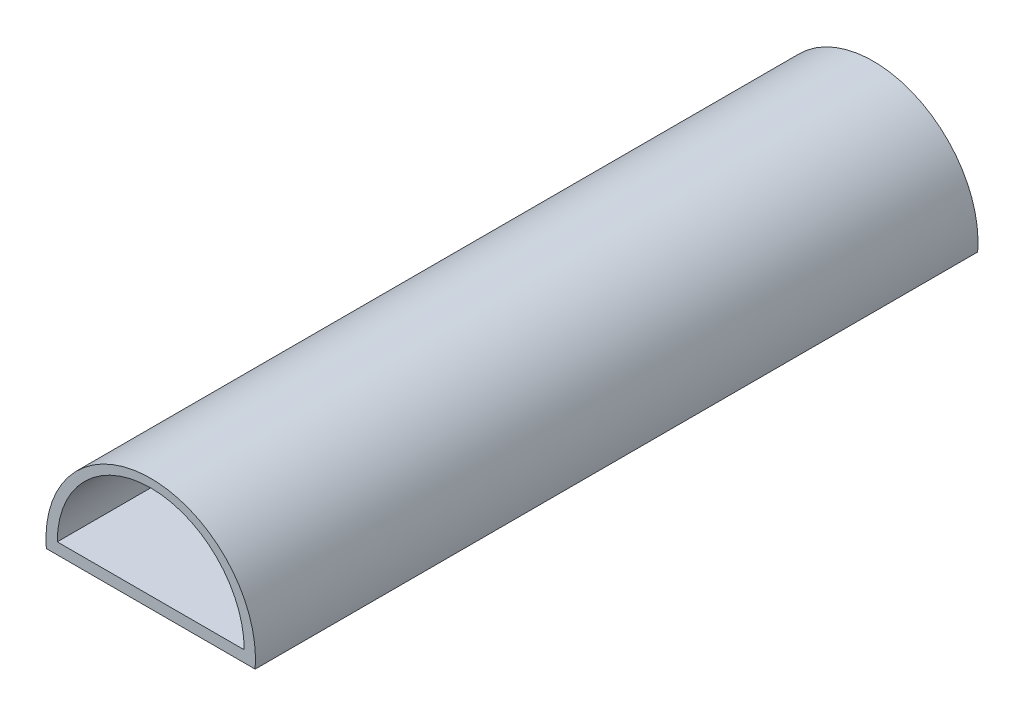
ISO-10303-21;
HEADER;
FILE_DESCRIPTION(('STEP AP214'),'2;1');
FILE_NAME('part.step','',(''),(''),'','','');
FILE_SCHEMA(('AUTOMOTIVE_DESIGN { 1 0 10303 214 1 1 1 1 }'));
ENDSEC;
DATA;
#1=APPLICATION_CONTEXT('core data for automotive mechanical design processes');
#2=APPLICATION_PROTOCOL_DEFINITION('international standard','automotive_design',2000,#1);
#3=PRODUCT_CONTEXT('',#1,'mechanical');
#4=PRODUCT('Part','Part','',(#3));
#5=PRODUCT_RELATED_PRODUCT_CATEGORY('part','',(#4));
#6=PRODUCT_DEFINITION_FORMATION('','',#4);
#7=PRODUCT_DEFINITION_CONTEXT('part definition',#1,'design');
#8=PRODUCT_DEFINITION('design','',#6,#7);
#9=PRODUCT_DEFINITION_SHAPE('','',#8);
#10=(LENGTH_UNIT() NAMED_UNIT(*) SI_UNIT(.MILLI.,.METRE.));
#11=(NAMED_UNIT(*) PLANE_ANGLE_UNIT() SI_UNIT($,.RADIAN.));
#12=(NAMED_UNIT(*) SI_UNIT($,.STERADIAN.) SOLID_ANGLE_UNIT());
#13=UNCERTAINTY_MEASURE_WITH_UNIT(LENGTH_MEASURE(1.E-05),#10,'distance_accuracy_value','');
#14=(GEOMETRIC_REPRESENTATION_CONTEXT(3) GLOBAL_UNCERTAINTY_ASSIGNED_CONTEXT((#13)) GLOBAL_UNIT_ASSIGNED_CONTEXT((#10,
#11,#12)) REPRESENTATION_CONTEXT('',''));
#15=CARTESIAN_POINT('',(0.,0.,0.));
#16=DIRECTION('',(0.,0.,1.));
#17=DIRECTION('',(1.,0.,0.));
#18=AXIS2_PLACEMENT_3D('',#15,#16,#17);
#19=CARTESIAN_POINT('',(-8.42700279293845,-8.87685553456328,101.6));
#20=DIRECTION('',(0.,0.,-1.));
#21=DIRECTION('',(-1.,0.,0.));
#22=AXIS2_PLACEMENT_3D('',#19,#20,#21);
#23=PLANE('',#22);
#24=CARTESIAN_POINT('',(-8.42700279293845,-8.87685553456328,101.6));
#25=DIRECTION('',(0.,0.,1.));
#26=DIRECTION('',(-1.,0.,0.));
#27=AXIS2_PLACEMENT_3D('',#24,#25,#26);
#28=CIRCLE('',#27,14.7310367744908);
#29=CARTESIAN_POINT('',(6.25737220706155,-10.0484251273645,101.6));
#30=VERTEX_POINT('',#29);
#31=CARTESIAN_POINT('',(-23.1113777929385,-10.0484251273645,101.6));
#32=VERTEX_POINT('',#31);
#33=EDGE_CURVE('E103',#30,#32,#28,.T.);
#34=ORIENTED_EDGE('',*,*,#33,.T.);
#35=DIRECTION('',(1.,0.,0.));
#36=VECTOR('',#35,1.);
#37=CARTESIAN_POINT('',(-23.1113777929385,-10.0484251273645,101.6));
#38=LINE('',#37,#36);
#39=EDGE_CURVE('E107',#32,#30,#38,.T.);
#40=ORIENTED_EDGE('',*,*,#39,.T.);
#41=EDGE_LOOP('',(#34,#40));
#42=FACE_BOUND('',#41,.T.);
#43=CARTESIAN_POINT('',(-8.42700279293845,-8.46092512736455,101.6));
#44=DIRECTION('',(0.,0.,1.));
#45=DIRECTION('',(-1.,0.,0.));
#46=AXIS2_PLACEMENT_3D('',#43,#44,#45);
#47=CIRCLE('',#46,13.1445);
#48=CARTESIAN_POINT('',(4.71749720706154,-8.46092512736455,101.6));
#49=VERTEX_POINT('',#48);
#50=CARTESIAN_POINT('',(-21.5715027929384,-8.46092512736455,101.6));
#51=VERTEX_POINT('',#50);
#52=EDGE_CURVE('E83',#49,#51,#47,.T.);
#53=ORIENTED_EDGE('',*,*,#52,.F.);
#54=DIRECTION('',(1.,0.,0.));
#55=VECTOR('',#54,1.);
#56=CARTESIAN_POINT('',(-8.42700279293845,-8.46092512736455,101.6));
#57=LINE('',#56,#55);
#58=EDGE_CURVE('E78',#51,#49,#57,.T.);
#59=ORIENTED_EDGE('',*,*,#58,.F.);
#60=EDGE_LOOP('',(#53,#59));
#61=FACE_BOUND('',#60,.T.);
#62=ADVANCED_FACE('F39',(#42,#61),#23,.F.);
#63=CARTESIAN_POINT('',(-8.42700279293845,-8.87685553456328,0.));
#64=DIRECTION('',(0.,0.,-1.));
#65=DIRECTION('',(-1.,0.,0.));
#66=AXIS2_PLACEMENT_3D('',#63,#64,#65);
#67=PLANE('',#66);
#68=CARTESIAN_POINT('',(-8.42700279293845,-8.87685553456328,0.));
#69=DIRECTION('',(0.,0.,1.));
#70=DIRECTION('',(-1.,0.,0.));
#71=AXIS2_PLACEMENT_3D('',#68,#69,#70);
#72=CIRCLE('',#71,14.7310367744908);
#73=CARTESIAN_POINT('',(6.25737220706155,-10.0484251273645,0.));
#74=VERTEX_POINT('',#73);
#75=CARTESIAN_POINT('',(-23.1113777929385,-10.0484251273645,0.));
#76=VERTEX_POINT('',#75);
#77=EDGE_CURVE('E92',#74,#76,#72,.T.);
#78=ORIENTED_EDGE('',*,*,#77,.F.);
#79=DIRECTION('',(1.,0.,0.));
#80=VECTOR('',#79,1.);
#81=CARTESIAN_POINT('',(-23.1113777929385,-10.0484251273645,0.));
#82=LINE('',#81,#80);
#83=EDGE_CURVE('E108',#76,#74,#82,.T.);
#84=ORIENTED_EDGE('',*,*,#83,.F.);
#85=EDGE_LOOP('',(#78,#84));
#86=FACE_BOUND('',#85,.T.);
#87=DIRECTION('',(1.,0.,0.));
#88=VECTOR('',#87,1.);
#89=CARTESIAN_POINT('',(-8.42700279293845,-8.46092512736455,0.));
#90=LINE('',#89,#88);
#91=CARTESIAN_POINT('',(-21.5715027929384,-8.46092512736455,0.));
#92=VERTEX_POINT('',#91);
#93=CARTESIAN_POINT('',(4.71749720706154,-8.46092512736455,0.));
#94=VERTEX_POINT('',#93);
#95=EDGE_CURVE('E84',#92,#94,#90,.T.);
#96=ORIENTED_EDGE('',*,*,#95,.T.);
#97=CARTESIAN_POINT('',(-8.42700279293845,-8.46092512736455,0.));
#98=DIRECTION('',(0.,0.,1.));
#99=DIRECTION('',(-1.,0.,0.));
#100=AXIS2_PLACEMENT_3D('',#97,#98,#99);
#101=CIRCLE('',#100,13.1445);
#102=EDGE_CURVE('E89',#94,#92,#101,.T.);
#103=ORIENTED_EDGE('',*,*,#102,.T.);
#104=EDGE_LOOP('',(#96,#103));
#105=FACE_BOUND('',#104,.T.);
#106=ADVANCED_FACE('F124',(#86,#105),#67,.T.);
#107=CARTESIAN_POINT('',(-8.42700279293845,-8.87685553456328,101.6));
#108=DIRECTION('',(0.,0.,-1.));
#109=DIRECTION('',(-1.,0.,0.));
#110=AXIS2_PLACEMENT_3D('',#107,#108,#109);
#111=CYLINDRICAL_SURFACE('',#110,14.7310367744908);
#112=ORIENTED_EDGE('',*,*,#77,.T.);
#113=DIRECTION('',(0.,0.,-1.));
#114=VECTOR('',#113,1.);
#115=CARTESIAN_POINT('',(-23.1113777929385,-10.0484251273645,101.6));
#116=LINE('',#115,#114);
#117=EDGE_CURVE('E11',#32,#76,#116,.T.);
#118=ORIENTED_EDGE('',*,*,#117,.F.);
#119=ORIENTED_EDGE('',*,*,#33,.F.);
#120=DIRECTION('',(0.,0.,-1.));
#121=VECTOR('',#120,1.);
#122=CARTESIAN_POINT('',(6.25737220706155,-10.0484251273645,101.6));
#123=LINE('',#122,#121);
#124=EDGE_CURVE('E48',#30,#74,#123,.T.);
#125=ORIENTED_EDGE('',*,*,#124,.T.);
#126=EDGE_LOOP('',(#112,#118,#119,#125));
#127=FACE_BOUND('',#126,.T.);
#128=ADVANCED_FACE('F41',(#127),#111,.T.);
#129=CARTESIAN_POINT('',(-23.1113777929385,-10.0484251273645,101.6));
#130=DIRECTION('',(0.,1.,0.));
#131=DIRECTION('',(0.,0.,1.));
#132=AXIS2_PLACEMENT_3D('',#129,#130,#131);
#133=PLANE('',#132);
#134=ORIENTED_EDGE('',*,*,#83,.T.);
#135=ORIENTED_EDGE('',*,*,#124,.F.);
#136=ORIENTED_EDGE('',*,*,#39,.F.);
#137=ORIENTED_EDGE('',*,*,#117,.T.);
#138=EDGE_LOOP('',(#134,#135,#136,#137));
#139=FACE_BOUND('',#138,.T.);
#140=ADVANCED_FACE('F126',(#139),#133,.F.);
#141=CARTESIAN_POINT('',(-8.42700279293845,-8.46092512736455,101.6));
#142=DIRECTION('',(0.,0.,-1.));
#143=DIRECTION('',(-1.,0.,0.));
#144=AXIS2_PLACEMENT_3D('',#141,#142,#143);
#145=CYLINDRICAL_SURFACE('',#144,13.1445);
#146=ORIENTED_EDGE('',*,*,#102,.F.);
#147=DIRECTION('',(0.,0.,-1.));
#148=VECTOR('',#147,1.);
#149=CARTESIAN_POINT('',(4.71749720706154,-8.46092512736455,101.6));
#150=LINE('',#149,#148);
#151=EDGE_CURVE('E60',#49,#94,#150,.T.);
#152=ORIENTED_EDGE('',*,*,#151,.F.);
#153=ORIENTED_EDGE('',*,*,#52,.T.);
#154=DIRECTION('',(0.,0.,-1.));
#155=VECTOR('',#154,1.);
#156=CARTESIAN_POINT('',(-21.5715027929384,-8.46092512736455,101.6));
#157=LINE('',#156,#155);
#158=EDGE_CURVE('E55',#51,#92,#157,.T.);
#159=ORIENTED_EDGE('',*,*,#158,.T.);
#160=EDGE_LOOP('',(#146,#152,#153,#159));
#161=FACE_BOUND('',#160,.T.);
#162=ADVANCED_FACE('F87',(#161),#145,.F.);
#163=CARTESIAN_POINT('',(-8.42700279293845,-8.46092512736455,101.6));
#164=DIRECTION('',(0.,1.,0.));
#165=DIRECTION('',(-1.,0.,0.));
#166=AXIS2_PLACEMENT_3D('',#163,#164,#165);
#167=PLANE('',#166);
#168=ORIENTED_EDGE('',*,*,#95,.F.);
#169=ORIENTED_EDGE('',*,*,#158,.F.);
#170=ORIENTED_EDGE('',*,*,#58,.T.);
#171=ORIENTED_EDGE('',*,*,#151,.T.);
#172=EDGE_LOOP('',(#168,#169,#170,#171));
#173=FACE_BOUND('',#172,.T.);
#174=ADVANCED_FACE('F79',(#173),#167,.T.);
#175=CLOSED_SHELL('',(#62,#106,#128,#140,#162,#174));
#176=MANIFOLD_SOLID_BREP('B2',#175);
#177=ADVANCED_BREP_SHAPE_REPRESENTATION('',(#18,#176),#14);
#178=SHAPE_DEFINITION_REPRESENTATION(#9,#177);
ENDSEC;
END-ISO-10303-21;
